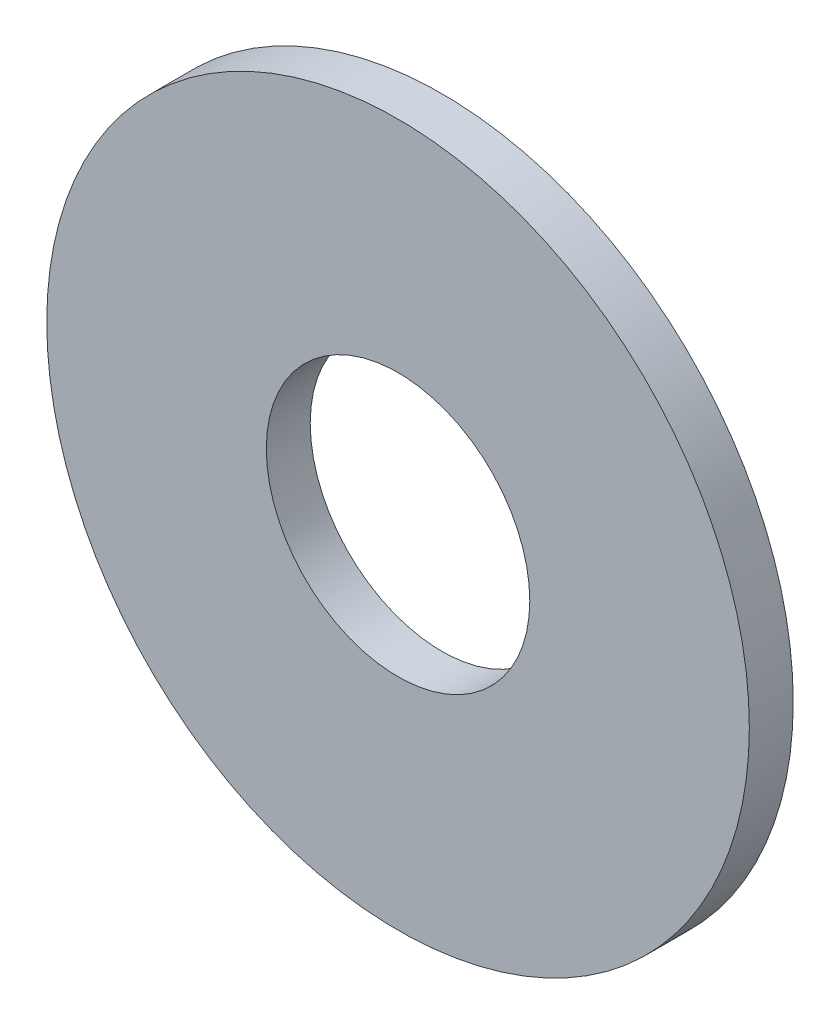
ISO-10303-21;
HEADER;
FILE_DESCRIPTION(('STEP AP214'),'2;1');
FILE_NAME('part.step','',(''),(''),'','','');
FILE_SCHEMA(('AUTOMOTIVE_DESIGN { 1 0 10303 214 1 1 1 1 }'));
ENDSEC;
DATA;
#1=APPLICATION_CONTEXT('core data for automotive mechanical design processes');
#2=APPLICATION_PROTOCOL_DEFINITION('international standard','automotive_design',2000,#1);
#3=PRODUCT_CONTEXT('',#1,'mechanical');
#4=PRODUCT('Part','Part','',(#3));
#5=PRODUCT_RELATED_PRODUCT_CATEGORY('part','',(#4));
#6=PRODUCT_DEFINITION_FORMATION('','',#4);
#7=PRODUCT_DEFINITION_CONTEXT('part definition',#1,'design');
#8=PRODUCT_DEFINITION('design','',#6,#7);
#9=PRODUCT_DEFINITION_SHAPE('','',#8);
#10=(LENGTH_UNIT() NAMED_UNIT(*) SI_UNIT(.MILLI.,.METRE.));
#11=(NAMED_UNIT(*) PLANE_ANGLE_UNIT() SI_UNIT($,.RADIAN.));
#12=(NAMED_UNIT(*) SI_UNIT($,.STERADIAN.) SOLID_ANGLE_UNIT());
#13=UNCERTAINTY_MEASURE_WITH_UNIT(LENGTH_MEASURE(1.E-05),#10,'distance_accuracy_value','');
#14=(GEOMETRIC_REPRESENTATION_CONTEXT(3) GLOBAL_UNCERTAINTY_ASSIGNED_CONTEXT((#13)) GLOBAL_UNIT_ASSIGNED_CONTEXT((#10,
#11,#12)) REPRESENTATION_CONTEXT('',''));
#15=CARTESIAN_POINT('',(0.,0.,0.));
#16=DIRECTION('',(0.,0.,1.));
#17=DIRECTION('',(1.,0.,0.));
#18=AXIS2_PLACEMENT_3D('',#15,#16,#17);
#19=CARTESIAN_POINT('',(0.,0.,10.));
#20=DIRECTION('',(0.,0.,-1.));
#21=DIRECTION('',(-1.,0.,0.));
#22=AXIS2_PLACEMENT_3D('',#19,#20,#21);
#23=CYLINDRICAL_SURFACE('',#22,8.);
#24=CARTESIAN_POINT('',(0.,0.,10.));
#25=DIRECTION('',(0.,0.,1.));
#26=DIRECTION('',(1.,0.,0.));
#27=AXIS2_PLACEMENT_3D('',#24,#25,#26);
#28=CIRCLE('',#27,8.);
#29=CARTESIAN_POINT('',(8.,0.,10.));
#30=VERTEX_POINT('',#29);
#31=EDGE_CURVE('E10',#30,#30,#28,.T.);
#32=ORIENTED_EDGE('',*,*,#31,.F.);
#33=EDGE_LOOP('',(#32));
#34=FACE_BOUND('',#33,.T.);
#35=CARTESIAN_POINT('',(0.,0.,9.));
#36=DIRECTION('',(0.,0.,-1.));
#37=DIRECTION('',(-1.,0.,0.));
#38=AXIS2_PLACEMENT_3D('',#35,#36,#37);
#39=CIRCLE('',#38,8.);
#40=CARTESIAN_POINT('',(-8.,0.,9.));
#41=VERTEX_POINT('',#40);
#42=EDGE_CURVE('E40',#41,#41,#39,.T.);
#43=ORIENTED_EDGE('',*,*,#42,.F.);
#44=EDGE_LOOP('',(#43));
#45=FACE_BOUND('',#44,.T.);
#46=ADVANCED_FACE('F34',(#34,#45),#23,.T.);
#47=CARTESIAN_POINT('',(0.,0.,10.));
#48=DIRECTION('',(0.,0.,1.));
#49=DIRECTION('',(1.,0.,0.));
#50=AXIS2_PLACEMENT_3D('',#47,#48,#49);
#51=PLANE('',#50);
#52=CARTESIAN_POINT('',(0.,0.,10.));
#53=DIRECTION('',(0.,0.,1.));
#54=DIRECTION('',(1.,0.,0.));
#55=AXIS2_PLACEMENT_3D('',#52,#53,#54);
#56=CIRCLE('',#55,3.);
#57=CARTESIAN_POINT('',(3.,0.,10.));
#58=VERTEX_POINT('',#57);
#59=EDGE_CURVE('E44',#58,#58,#56,.T.);
#60=ORIENTED_EDGE('',*,*,#59,.F.);
#61=EDGE_LOOP('',(#60));
#62=FACE_BOUND('',#61,.T.);
#63=ORIENTED_EDGE('',*,*,#31,.T.);
#64=EDGE_LOOP('',(#63));
#65=FACE_BOUND('',#64,.T.);
#66=ADVANCED_FACE('F58',(#62,#65),#51,.T.);
#67=CARTESIAN_POINT('',(0.,0.,9.));
#68=DIRECTION('',(0.,0.,-1.));
#69=DIRECTION('',(-1.,0.,0.));
#70=AXIS2_PLACEMENT_3D('',#67,#68,#69);
#71=PLANE('',#70);
#72=CARTESIAN_POINT('',(0.,0.,9.));
#73=DIRECTION('',(0.,0.,-1.));
#74=DIRECTION('',(-1.,0.,0.));
#75=AXIS2_PLACEMENT_3D('',#72,#73,#74);
#76=CIRCLE('',#75,3.);
#77=CARTESIAN_POINT('',(-3.,0.,9.));
#78=VERTEX_POINT('',#77);
#79=EDGE_CURVE('E48',#78,#78,#76,.T.);
#80=ORIENTED_EDGE('',*,*,#79,.F.);
#81=EDGE_LOOP('',(#80));
#82=FACE_BOUND('',#81,.T.);
#83=ORIENTED_EDGE('',*,*,#42,.T.);
#84=EDGE_LOOP('',(#83));
#85=FACE_BOUND('',#84,.T.);
#86=ADVANCED_FACE('F56',(#82,#85),#71,.T.);
#87=CARTESIAN_POINT('',(0.,0.,18.));
#88=DIRECTION('',(0.,0.,-1.));
#89=DIRECTION('',(-1.,0.,0.));
#90=AXIS2_PLACEMENT_3D('',#87,#88,#89);
#91=CYLINDRICAL_SURFACE('',#90,3.);
#92=ORIENTED_EDGE('',*,*,#59,.T.);
#93=EDGE_LOOP('',(#92));
#94=FACE_BOUND('',#93,.T.);
#95=ORIENTED_EDGE('',*,*,#79,.T.);
#96=EDGE_LOOP('',(#95));
#97=FACE_BOUND('',#96,.T.);
#98=ADVANCED_FACE('F54',(#94,#97),#91,.F.);
#99=CLOSED_SHELL('',(#46,#66,#86,#98));
#100=MANIFOLD_SOLID_BREP('B2',#99);
#101=ADVANCED_BREP_SHAPE_REPRESENTATION('',(#18,#100),#14);
#102=SHAPE_DEFINITION_REPRESENTATION(#9,#101);
ENDSEC;
END-ISO-10303-21;
